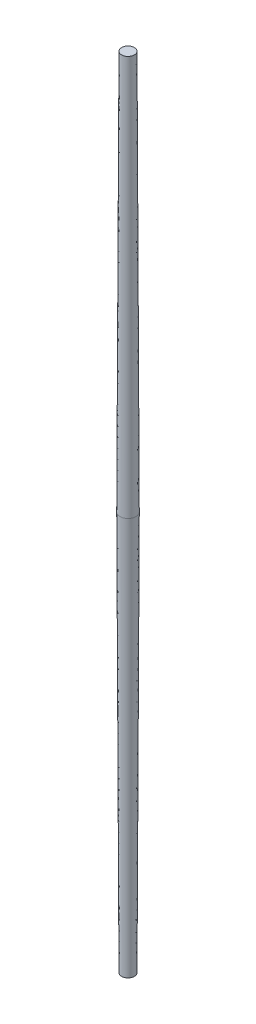
ISO-10303-21;
HEADER;
FILE_DESCRIPTION(('STEP AP214'),'2;1');
FILE_NAME('part.step','',(''),(''),'','','');
FILE_SCHEMA(('AUTOMOTIVE_DESIGN { 1 0 10303 214 1 1 1 1 }'));
ENDSEC;
DATA;
#1=APPLICATION_CONTEXT('core data for automotive mechanical design processes');
#2=APPLICATION_PROTOCOL_DEFINITION('international standard','automotive_design',2000,#1);
#3=PRODUCT_CONTEXT('',#1,'mechanical');
#4=PRODUCT('Part','Part','',(#3));
#5=PRODUCT_RELATED_PRODUCT_CATEGORY('part','',(#4));
#6=PRODUCT_DEFINITION_FORMATION('','',#4);
#7=PRODUCT_DEFINITION_CONTEXT('part definition',#1,'design');
#8=PRODUCT_DEFINITION('design','',#6,#7);
#9=PRODUCT_DEFINITION_SHAPE('','',#8);
#10=(LENGTH_UNIT() NAMED_UNIT(*) SI_UNIT(.MILLI.,.METRE.));
#11=(NAMED_UNIT(*) PLANE_ANGLE_UNIT() SI_UNIT($,.RADIAN.));
#12=(NAMED_UNIT(*) SI_UNIT($,.STERADIAN.) SOLID_ANGLE_UNIT());
#13=UNCERTAINTY_MEASURE_WITH_UNIT(LENGTH_MEASURE(1.E-05),#10,'distance_accuracy_value','');
#14=(GEOMETRIC_REPRESENTATION_CONTEXT(3) GLOBAL_UNCERTAINTY_ASSIGNED_CONTEXT((#13)) GLOBAL_UNIT_ASSIGNED_CONTEXT((#10,
#11,#12)) REPRESENTATION_CONTEXT('',''));
#15=CARTESIAN_POINT('',(0.,0.,0.));
#16=DIRECTION('',(0.,0.,1.));
#17=DIRECTION('',(1.,0.,0.));
#18=AXIS2_PLACEMENT_3D('',#15,#16,#17);
#19=CARTESIAN_POINT('',(0.,0.,0.));
#20=DIRECTION('',(0.,-1.,0.));
#21=DIRECTION('',(1.,0.,0.));
#22=AXIS2_PLACEMENT_3D('',#19,#20,#21);
#23=CONICAL_SURFACE('',#22,5.,0.00399997866687154);
#24=CARTESIAN_POINT('',(0.,250.,0.));
#25=DIRECTION('',(0.,1.,0.));
#26=DIRECTION('',(-1.,0.,0.));
#27=AXIS2_PLACEMENT_3D('',#24,#25,#26);
#28=CIRCLE('',#27,3.99999999999998);
#29=CARTESIAN_POINT('',(-3.99999999999996,250.,0.));
#30=VERTEX_POINT('',#29);
#31=EDGE_CURVE('E10',#30,#30,#28,.T.);
#32=ORIENTED_EDGE('',*,*,#31,.F.);
#33=EDGE_LOOP('',(#32));
#34=FACE_BOUND('',#33,.T.);
#35=CARTESIAN_POINT('',(0.,0.,0.));
#36=DIRECTION('',(0.,1.,0.));
#37=DIRECTION('',(-1.,0.,0.));
#38=AXIS2_PLACEMENT_3D('',#35,#36,#37);
#39=CIRCLE('',#38,5.);
#40=CARTESIAN_POINT('',(-5.,0.,0.));
#41=VERTEX_POINT('',#40);
#42=EDGE_CURVE('E37',#41,#41,#39,.T.);
#43=ORIENTED_EDGE('',*,*,#42,.T.);
#44=EDGE_LOOP('',(#43));
#45=FACE_BOUND('',#44,.T.);
#46=ADVANCED_FACE('F31',(#34,#45),#23,.T.);
#47=CARTESIAN_POINT('',(4.,250.,0.));
#48=DIRECTION('',(0.,-1.,0.));
#49=DIRECTION('',(1.,0.,0.));
#50=AXIS2_PLACEMENT_3D('',#47,#48,#49);
#51=PLANE('',#50);
#52=ORIENTED_EDGE('',*,*,#31,.T.);
#53=EDGE_LOOP('',(#52));
#54=FACE_BOUND('',#53,.T.);
#55=ADVANCED_FACE('F57',(#54),#51,.F.);
#56=CARTESIAN_POINT('',(0.,0.,0.));
#57=DIRECTION('',(0.,1.,0.));
#58=DIRECTION('',(1.,0.,0.));
#59=AXIS2_PLACEMENT_3D('',#56,#57,#58);
#60=CONICAL_SURFACE('',#59,5.,0.00399997866687154);
#61=CARTESIAN_POINT('',(0.,-250.,0.));
#62=DIRECTION('',(0.,1.,0.));
#63=DIRECTION('',(-1.,0.,0.));
#64=AXIS2_PLACEMENT_3D('',#61,#62,#63);
#65=CIRCLE('',#64,3.99999999999998);
#66=CARTESIAN_POINT('',(-4.,-250.,0.));
#67=VERTEX_POINT('',#66);
#68=EDGE_CURVE('E41',#67,#67,#65,.T.);
#69=ORIENTED_EDGE('',*,*,#68,.T.);
#70=EDGE_LOOP('',(#69));
#71=FACE_BOUND('',#70,.T.);
#72=ORIENTED_EDGE('',*,*,#42,.F.);
#73=EDGE_LOOP('',(#72));
#74=FACE_BOUND('',#73,.T.);
#75=ADVANCED_FACE('F48',(#71,#74),#60,.T.);
#76=CARTESIAN_POINT('',(3.99999999999996,-250.,0.));
#77=DIRECTION('',(0.,1.,0.));
#78=DIRECTION('',(1.,0.,0.));
#79=AXIS2_PLACEMENT_3D('',#76,#77,#78);
#80=PLANE('',#79);
#81=ORIENTED_EDGE('',*,*,#68,.F.);
#82=EDGE_LOOP('',(#81));
#83=FACE_BOUND('',#82,.T.);
#84=ADVANCED_FACE('F51',(#83),#80,.F.);
#85=CLOSED_SHELL('',(#46,#55,#75,#84));
#86=MANIFOLD_SOLID_BREP('B2',#85);
#87=ADVANCED_BREP_SHAPE_REPRESENTATION('',(#18,#86),#14);
#88=SHAPE_DEFINITION_REPRESENTATION(#9,#87);
ENDSEC;
END-ISO-10303-21;
